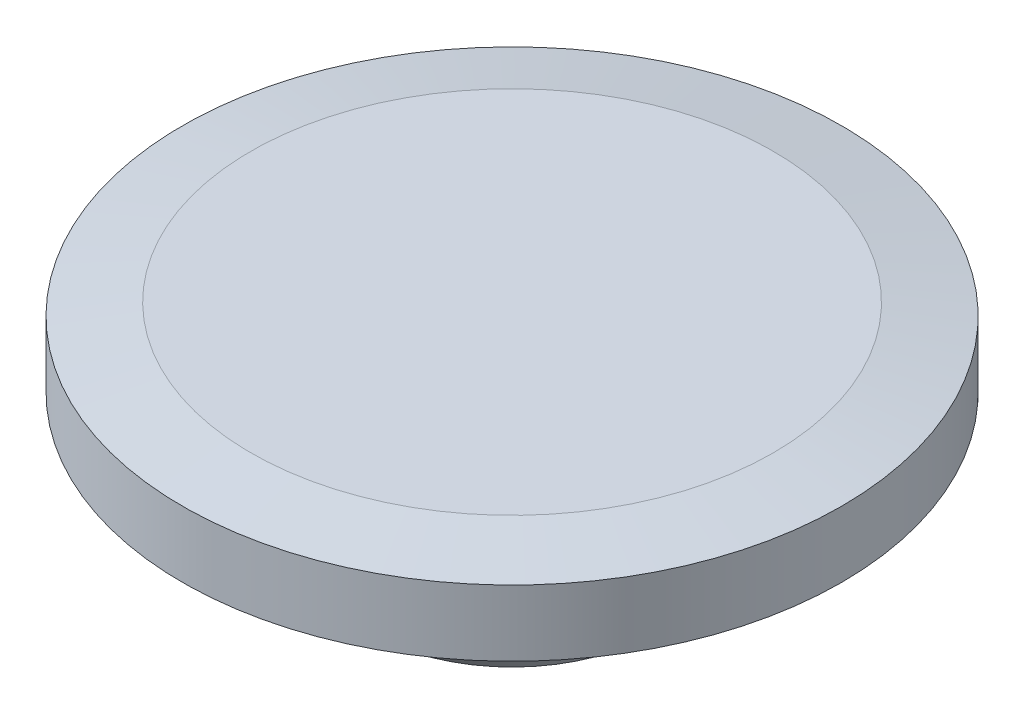
ISO-10303-21;
HEADER;
FILE_DESCRIPTION(('STEP AP214'),'2;1');
FILE_NAME('part.step','',(''),(''),'','','');
FILE_SCHEMA(('AUTOMOTIVE_DESIGN { 1 0 10303 214 1 1 1 1 }'));
ENDSEC;
DATA;
#1=APPLICATION_CONTEXT('core data for automotive mechanical design processes');
#2=APPLICATION_PROTOCOL_DEFINITION('international standard','automotive_design',2000,#1);
#3=PRODUCT_CONTEXT('',#1,'mechanical');
#4=PRODUCT('Part','Part','',(#3));
#5=PRODUCT_RELATED_PRODUCT_CATEGORY('part','',(#4));
#6=PRODUCT_DEFINITION_FORMATION('','',#4);
#7=PRODUCT_DEFINITION_CONTEXT('part definition',#1,'design');
#8=PRODUCT_DEFINITION('design','',#6,#7);
#9=PRODUCT_DEFINITION_SHAPE('','',#8);
#10=(LENGTH_UNIT() NAMED_UNIT(*) SI_UNIT(.MILLI.,.METRE.));
#11=(NAMED_UNIT(*) PLANE_ANGLE_UNIT() SI_UNIT($,.RADIAN.));
#12=(NAMED_UNIT(*) SI_UNIT($,.STERADIAN.) SOLID_ANGLE_UNIT());
#13=UNCERTAINTY_MEASURE_WITH_UNIT(LENGTH_MEASURE(1.E-05),#10,'distance_accuracy_value','');
#14=(GEOMETRIC_REPRESENTATION_CONTEXT(3) GLOBAL_UNCERTAINTY_ASSIGNED_CONTEXT((#13)) GLOBAL_UNIT_ASSIGNED_CONTEXT((#10,
#11,#12)) REPRESENTATION_CONTEXT('',''));
#15=CARTESIAN_POINT('',(0.,0.,0.));
#16=DIRECTION('',(0.,0.,1.));
#17=DIRECTION('',(1.,0.,0.));
#18=AXIS2_PLACEMENT_3D('',#15,#16,#17);
#19=CARTESIAN_POINT('',(0.,-1.6,0.));
#20=DIRECTION('',(0.,-1.,0.));
#21=DIRECTION('',(1.,0.,0.));
#22=AXIS2_PLACEMENT_3D('',#19,#20,#21);
#23=CYLINDRICAL_SURFACE('',#22,3.);
#24=CARTESIAN_POINT('',(0.,3.4,0.));
#25=DIRECTION('',(0.,-1.,0.));
#26=DIRECTION('',(1.,0.,0.));
#27=AXIS2_PLACEMENT_3D('',#24,#25,#26);
#28=CIRCLE('',#27,3.);
#29=CARTESIAN_POINT('',(-2.36167313572391,3.4,-1.85));
#30=VERTEX_POINT('',#29);
#31=CARTESIAN_POINT('',(-2.36167313572391,3.4,1.85));
#32=VERTEX_POINT('',#31);
#33=EDGE_CURVE('E250',#30,#32,#28,.T.);
#34=ORIENTED_EDGE('',*,*,#33,.T.);
#35=DIRECTION('',(0.,-1.,0.));
#36=VECTOR('',#35,1.);
#37=CARTESIAN_POINT('',(-2.36167313572391,-1.6,1.85));
#38=LINE('',#37,#36);
#39=CARTESIAN_POINT('',(-2.36167313572391,-1.6,1.85));
#40=VERTEX_POINT('',#39);
#41=EDGE_CURVE('E246',#32,#40,#38,.T.);
#42=ORIENTED_EDGE('',*,*,#41,.T.);
#43=CARTESIAN_POINT('',(0.,-1.6,0.));
#44=DIRECTION('',(0.,-1.,0.));
#45=DIRECTION('',(1.,0.,0.));
#46=AXIS2_PLACEMENT_3D('',#43,#44,#45);
#47=CIRCLE('',#46,3.);
#48=CARTESIAN_POINT('',(-2.36167313572391,-1.6,-1.85));
#49=VERTEX_POINT('',#48);
#50=EDGE_CURVE('E278',#49,#40,#47,.T.);
#51=ORIENTED_EDGE('',*,*,#50,.F.);
#52=DIRECTION('',(0.,-1.,0.));
#53=VECTOR('',#52,1.);
#54=CARTESIAN_POINT('',(-2.36167313572391,-1.6,-1.85));
#55=LINE('',#54,#53);
#56=EDGE_CURVE('E236',#30,#49,#55,.T.);
#57=ORIENTED_EDGE('',*,*,#56,.F.);
#58=EDGE_LOOP('',(#34,#42,#51,#57));
#59=FACE_BOUND('',#58,.T.);
#60=ADVANCED_FACE('F51',(#59),#23,.T.);
#61=CARTESIAN_POINT('',(0.,-1.6,0.));
#62=DIRECTION('',(0.,1.,0.));
#63=DIRECTION('',(-1.,0.,0.));
#64=AXIS2_PLACEMENT_3D('',#61,#62,#63);
#65=PLANE('',#64);
#66=ORIENTED_EDGE('',*,*,#50,.T.);
#67=DIRECTION('',(1.,0.,0.));
#68=VECTOR('',#67,1.);
#69=CARTESIAN_POINT('',(0.,-1.6,1.85));
#70=LINE('',#69,#68);
#71=CARTESIAN_POINT('',(-0.35,-1.6,1.85));
#72=VERTEX_POINT('',#71);
#73=EDGE_CURVE('E242',#40,#72,#70,.T.);
#74=ORIENTED_EDGE('',*,*,#73,.T.);
#75=DIRECTION('',(0.707106781186548,0.,-0.707106781186547));
#76=VECTOR('',#75,1.);
#77=CARTESIAN_POINT('',(0.75,-1.6,0.75));
#78=LINE('',#77,#76);
#79=CARTESIAN_POINT('',(0.4,-1.6,1.1));
#80=VERTEX_POINT('',#79);
#81=EDGE_CURVE('E298',#72,#80,#78,.T.);
#82=ORIENTED_EDGE('',*,*,#81,.T.);
#83=DIRECTION('',(0.,0.,-1.));
#84=VECTOR('',#83,1.);
#85=CARTESIAN_POINT('',(0.4,-1.6,0.));
#86=LINE('',#85,#84);
#87=CARTESIAN_POINT('',(0.4,-1.6,-1.1));
#88=VERTEX_POINT('',#87);
#89=EDGE_CURVE('E290',#80,#88,#86,.T.);
#90=ORIENTED_EDGE('',*,*,#89,.T.);
#91=DIRECTION('',(0.707106781186547,0.,0.707106781186548));
#92=VECTOR('',#91,1.);
#93=CARTESIAN_POINT('',(0.75,-1.6,-0.75));
#94=LINE('',#93,#92);
#95=CARTESIAN_POINT('',(-0.35,-1.6,-1.85));
#96=VERTEX_POINT('',#95);
#97=EDGE_CURVE('E294',#96,#88,#94,.T.);
#98=ORIENTED_EDGE('',*,*,#97,.F.);
#99=DIRECTION('',(1.,0.,0.));
#100=VECTOR('',#99,1.);
#101=CARTESIAN_POINT('',(0.,-1.6,-1.85));
#102=LINE('',#101,#100);
#103=EDGE_CURVE('E233',#49,#96,#102,.T.);
#104=ORIENTED_EDGE('',*,*,#103,.F.);
#105=EDGE_LOOP('',(#66,#74,#82,#90,#98,#104));
#106=FACE_BOUND('',#105,.T.);
#107=ADVANCED_FACE('F378',(#106),#65,.F.);
#108=CARTESIAN_POINT('',(0.,5.5,0.));
#109=DIRECTION('',(0.,-1.,0.));
#110=DIRECTION('',(1.,0.,0.));
#111=AXIS2_PLACEMENT_3D('',#108,#109,#110);
#112=PLANE('',#111);
#113=CARTESIAN_POINT('',(0.,5.5,0.));
#114=DIRECTION('',(0.,-1.,0.));
#115=DIRECTION('',(1.,0.,0.));
#116=AXIS2_PLACEMENT_3D('',#113,#114,#115);
#117=CIRCLE('',#116,15.0607689879512);
#118=CARTESIAN_POINT('',(15.0607689879512,5.5,0.));
#119=VERTEX_POINT('',#118);
#120=EDGE_CURVE('E274',#119,#119,#117,.T.);
#121=ORIENTED_EDGE('',*,*,#120,.F.);
#122=EDGE_LOOP('',(#121));
#123=FACE_BOUND('',#122,.T.);
#124=ADVANCED_FACE('F374',(#123),#112,.F.);
#125=CARTESIAN_POINT('',(0.,4.80540728933231,0.));
#126=DIRECTION('',(0.,-1.,0.));
#127=DIRECTION('',(1.,0.,0.));
#128=AXIS2_PLACEMENT_3D('',#125,#126,#127);
#129=CONICAL_SURFACE('',#128,19.,1.39626340159547);
#130=ORIENTED_EDGE('',*,*,#120,.T.);
#131=EDGE_LOOP('',(#130));
#132=FACE_BOUND('',#131,.T.);
#133=CARTESIAN_POINT('',(0.,4.80540728933231,0.));
#134=DIRECTION('',(0.,-1.,0.));
#135=DIRECTION('',(1.,0.,0.));
#136=AXIS2_PLACEMENT_3D('',#133,#134,#135);
#137=CIRCLE('',#136,19.);
#138=CARTESIAN_POINT('',(19.,4.80540728933231,0.));
#139=VERTEX_POINT('',#138);
#140=EDGE_CURVE('E270',#139,#139,#137,.T.);
#141=ORIENTED_EDGE('',*,*,#140,.F.);
#142=EDGE_LOOP('',(#141));
#143=FACE_BOUND('',#142,.T.);
#144=ADVANCED_FACE('F370',(#132,#143),#129,.T.);
#145=CARTESIAN_POINT('',(0.,-1.6,0.));
#146=DIRECTION('',(0.,-1.,0.));
#147=DIRECTION('',(1.,0.,0.));
#148=AXIS2_PLACEMENT_3D('',#145,#146,#147);
#149=CYLINDRICAL_SURFACE('',#148,19.);
#150=CARTESIAN_POINT('',(0.,0.999999999999999,0.));
#151=DIRECTION('',(0.,-1.,0.));
#152=DIRECTION('',(1.,0.,0.));
#153=AXIS2_PLACEMENT_3D('',#150,#151,#152);
#154=CIRCLE('',#153,19.);
#155=CARTESIAN_POINT('',(19.,0.999999999999999,0.));
#156=VERTEX_POINT('',#155);
#157=EDGE_CURVE('E286',#156,#156,#154,.F.);
#158=ORIENTED_EDGE('',*,*,#157,.T.);
#159=EDGE_LOOP('',(#158));
#160=FACE_BOUND('',#159,.T.);
#161=ORIENTED_EDGE('',*,*,#140,.T.);
#162=EDGE_LOOP('',(#161));
#163=FACE_BOUND('',#162,.T.);
#164=ADVANCED_FACE('F366',(#160,#163),#149,.T.);
#165=CARTESIAN_POINT('',(0.,0.,0.));
#166=DIRECTION('',(0.,-1.,0.));
#167=DIRECTION('',(1.,0.,0.));
#168=AXIS2_PLACEMENT_3D('',#165,#166,#167);
#169=PLANE('',#168);
#170=CARTESIAN_POINT('',(0.,0.,0.));
#171=DIRECTION('',(0.,-1.,0.));
#172=DIRECTION('',(1.,0.,0.));
#173=AXIS2_PLACEMENT_3D('',#170,#171,#172);
#174=CIRCLE('',#173,10.8556535720254);
#175=CARTESIAN_POINT('',(10.8556535720254,0.,0.));
#176=VERTEX_POINT('',#175);
#177=EDGE_CURVE('E282',#176,#176,#174,.T.);
#178=ORIENTED_EDGE('',*,*,#177,.T.);
#179=EDGE_LOOP('',(#178));
#180=FACE_BOUND('',#179,.T.);
#181=CARTESIAN_POINT('',(0.,0.,0.));
#182=DIRECTION('',(0.,-1.,0.));
#183=DIRECTION('',(1.,0.,0.));
#184=AXIS2_PLACEMENT_3D('',#181,#182,#183);
#185=CIRCLE('',#184,10.35);
#186=CARTESIAN_POINT('',(10.35,0.,0.));
#187=VERTEX_POINT('',#186);
#188=EDGE_CURVE('E266',#187,#187,#185,.T.);
#189=ORIENTED_EDGE('',*,*,#188,.F.);
#190=EDGE_LOOP('',(#189));
#191=FACE_BOUND('',#190,.T.);
#192=ADVANCED_FACE('F362',(#180,#191),#169,.T.);
#193=CARTESIAN_POINT('',(0.,-1.6,0.));
#194=DIRECTION('',(0.,-1.,0.));
#195=DIRECTION('',(1.,0.,0.));
#196=AXIS2_PLACEMENT_3D('',#193,#194,#195);
#197=CYLINDRICAL_SURFACE('',#196,10.35);
#198=CARTESIAN_POINT('',(0.,-0.350000000000001,0.));
#199=DIRECTION('',(0.,-1.,0.));
#200=DIRECTION('',(1.,0.,0.));
#201=AXIS2_PLACEMENT_3D('',#198,#199,#200);
#202=CIRCLE('',#201,10.35);
#203=CARTESIAN_POINT('',(10.35,-0.350000000000001,0.));
#204=VERTEX_POINT('',#203);
#205=EDGE_CURVE('E262',#204,#204,#202,.T.);
#206=ORIENTED_EDGE('',*,*,#205,.F.);
#207=EDGE_LOOP('',(#206));
#208=FACE_BOUND('',#207,.T.);
#209=ORIENTED_EDGE('',*,*,#188,.T.);
#210=EDGE_LOOP('',(#209));
#211=FACE_BOUND('',#210,.T.);
#212=ADVANCED_FACE('F358',(#208,#211),#197,.T.);
#213=CARTESIAN_POINT('',(0.,-0.350000000000001,0.));
#214=DIRECTION('',(0.,1.,0.));
#215=DIRECTION('',(-1.,0.,0.));
#216=AXIS2_PLACEMENT_3D('',#213,#214,#215);
#217=PLANE('',#216);
#218=CARTESIAN_POINT('',(0.,-0.350000000000001,0.));
#219=DIRECTION('',(0.,-1.,0.));
#220=DIRECTION('',(1.,0.,0.));
#221=AXIS2_PLACEMENT_3D('',#218,#219,#220);
#222=CIRCLE('',#221,8.6);
#223=CARTESIAN_POINT('',(8.6,-0.350000000000001,0.));
#224=VERTEX_POINT('',#223);
#225=EDGE_CURVE('E258',#224,#224,#222,.T.);
#226=ORIENTED_EDGE('',*,*,#225,.F.);
#227=EDGE_LOOP('',(#226));
#228=FACE_BOUND('',#227,.T.);
#229=ORIENTED_EDGE('',*,*,#205,.T.);
#230=EDGE_LOOP('',(#229));
#231=FACE_BOUND('',#230,.T.);
#232=ADVANCED_FACE('F354',(#228,#231),#217,.F.);
#233=CARTESIAN_POINT('',(0.,-1.6,0.));
#234=DIRECTION('',(0.,-1.,0.));
#235=DIRECTION('',(1.,0.,0.));
#236=AXIS2_PLACEMENT_3D('',#233,#234,#235);
#237=CYLINDRICAL_SURFACE('',#236,8.6);
#238=CARTESIAN_POINT('',(0.,-6.34999999999999,0.));
#239=DIRECTION('',(0.,1.,0.));
#240=DIRECTION('',(-1.,0.,0.));
#241=AXIS2_PLACEMENT_3D('',#238,#239,#240);
#242=CIRCLE('',#241,8.6);
#243=CARTESIAN_POINT('',(-8.6,-6.34999999999999,0.));
#244=VERTEX_POINT('',#243);
#245=EDGE_CURVE('E11',#244,#244,#242,.T.);
#246=ORIENTED_EDGE('',*,*,#245,.T.);
#247=EDGE_LOOP('',(#246));
#248=FACE_BOUND('',#247,.T.);
#249=ORIENTED_EDGE('',*,*,#225,.T.);
#250=EDGE_LOOP('',(#249));
#251=FACE_BOUND('',#250,.T.);
#252=ADVANCED_FACE('F350',(#248,#251),#237,.T.);
#253=CARTESIAN_POINT('',(0.,-6.85,0.));
#254=DIRECTION('',(0.,1.,0.));
#255=DIRECTION('',(-1.,0.,0.));
#256=AXIS2_PLACEMENT_3D('',#253,#254,#255);
#257=PLANE('',#256);
#258=CARTESIAN_POINT('',(0.,-6.85,0.));
#259=DIRECTION('',(0.,1.,0.));
#260=DIRECTION('',(-1.,0.,0.));
#261=AXIS2_PLACEMENT_3D('',#258,#259,#260);
#262=CIRCLE('',#261,8.31132486540519);
#263=CARTESIAN_POINT('',(-8.31132486540519,-6.85,0.));
#264=VERTEX_POINT('',#263);
#265=EDGE_CURVE('E61',#264,#264,#262,.F.);
#266=ORIENTED_EDGE('',*,*,#265,.T.);
#267=EDGE_LOOP('',(#266));
#268=FACE_BOUND('',#267,.T.);
#269=DIRECTION('',(-0.707106781186547,0.,-0.707106781186548));
#270=VECTOR('',#269,1.);
#271=CARTESIAN_POINT('',(-3.85,-6.85,3.85));
#272=LINE('',#271,#270);
#273=CARTESIAN_POINT('',(-6.487707337822,-6.85,1.212292662178));
#274=VERTEX_POINT('',#273);
#275=CARTESIAN_POINT('',(-6.6,-6.85,1.1));
#276=VERTEX_POINT('',#275);
#277=EDGE_CURVE('E149',#274,#276,#272,.T.);
#278=ORIENTED_EDGE('',*,*,#277,.F.);
#279=CARTESIAN_POINT('',(0.,-6.85,0.));
#280=DIRECTION('',(0.,1.,0.));
#281=DIRECTION('',(-1.,0.,0.));
#282=AXIS2_PLACEMENT_3D('',#279,#280,#281);
#283=CIRCLE('',#282,6.6);
#284=CARTESIAN_POINT('',(-6.487707337822,-6.85,-1.21229266217801));
#285=VERTEX_POINT('',#284);
#286=EDGE_CURVE('E76',#274,#285,#283,.T.);
#287=ORIENTED_EDGE('',*,*,#286,.T.);
#288=DIRECTION('',(-0.707106781186547,0.,0.707106781186548));
#289=VECTOR('',#288,1.);
#290=CARTESIAN_POINT('',(-3.85,-6.85,-3.85));
#291=LINE('',#290,#289);
#292=CARTESIAN_POINT('',(-6.6,-6.85,-1.1));
#293=VERTEX_POINT('',#292);
#294=EDGE_CURVE('E173',#285,#293,#291,.T.);
#295=ORIENTED_EDGE('',*,*,#294,.T.);
#296=DIRECTION('',(0.,0.,1.));
#297=VECTOR('',#296,1.);
#298=CARTESIAN_POINT('',(-6.6,-6.85,0.));
#299=LINE('',#298,#297);
#300=EDGE_CURVE('E160',#293,#276,#299,.T.);
#301=ORIENTED_EDGE('',*,*,#300,.T.);
#302=EDGE_LOOP('',(#278,#287,#295,#301));
#303=FACE_BOUND('',#302,.T.);
#304=ADVANCED_FACE('F172',(#268,#303),#257,.F.);
#305=CARTESIAN_POINT('',(0.,-1.6,0.));
#306=DIRECTION('',(0.,-1.,0.));
#307=DIRECTION('',(1.,0.,0.));
#308=AXIS2_PLACEMENT_3D('',#305,#306,#307);
#309=CYLINDRICAL_SURFACE('',#308,5.6);
#310=DIRECTION('',(0.,-1.,0.));
#311=VECTOR('',#310,1.);
#312=CARTESIAN_POINT('',(-5.28559362796649,-1.6,-1.85));
#313=LINE('',#312,#311);
#314=CARTESIAN_POINT('',(-5.28559362796649,-5.85000000000001,-1.85));
#315=VERTEX_POINT('',#314);
#316=CARTESIAN_POINT('',(-5.28559362796649,3.4,-1.85));
#317=VERTEX_POINT('',#316);
#318=EDGE_CURVE('E230',#315,#317,#313,.F.);
#319=ORIENTED_EDGE('',*,*,#318,.F.);
#320=CARTESIAN_POINT('',(0.,-5.85000000000001,0.));
#321=DIRECTION('',(0.,1.,0.));
#322=DIRECTION('',(-1.,0.,0.));
#323=AXIS2_PLACEMENT_3D('',#320,#321,#322);
#324=CIRCLE('',#323,5.6);
#325=CARTESIAN_POINT('',(-5.28559362796649,-5.85000000000001,1.85));
#326=VERTEX_POINT('',#325);
#327=EDGE_CURVE('E302',#315,#326,#324,.F.);
#328=ORIENTED_EDGE('',*,*,#327,.T.);
#329=DIRECTION('',(0.,-1.,0.));
#330=VECTOR('',#329,1.);
#331=CARTESIAN_POINT('',(-5.28559362796649,-1.6,1.85));
#332=LINE('',#331,#330);
#333=CARTESIAN_POINT('',(-5.28559362796649,3.4,1.85));
#334=VERTEX_POINT('',#333);
#335=EDGE_CURVE('E239',#326,#334,#332,.F.);
#336=ORIENTED_EDGE('',*,*,#335,.T.);
#337=CARTESIAN_POINT('',(0.,3.4,0.));
#338=DIRECTION('',(0.,-1.,0.));
#339=DIRECTION('',(1.,0.,0.));
#340=AXIS2_PLACEMENT_3D('',#337,#338,#339);
#341=CIRCLE('',#340,5.6);
#342=EDGE_CURVE('E254',#317,#334,#341,.T.);
#343=ORIENTED_EDGE('',*,*,#342,.F.);
#344=EDGE_LOOP('',(#319,#328,#336,#343));
#345=FACE_BOUND('',#344,.T.);
#346=ADVANCED_FACE('F343',(#345),#309,.F.);
#347=CARTESIAN_POINT('',(0.,3.4,0.));
#348=DIRECTION('',(0.,1.,0.));
#349=DIRECTION('',(-1.,0.,0.));
#350=AXIS2_PLACEMENT_3D('',#347,#348,#349);
#351=PLANE('',#350);
#352=ORIENTED_EDGE('',*,*,#33,.F.);
#353=DIRECTION('',(-1.,0.,0.));
#354=VECTOR('',#353,1.);
#355=CARTESIAN_POINT('',(0.,3.4,-1.85));
#356=LINE('',#355,#354);
#357=CARTESIAN_POINT('',(-0.35,3.4,-1.85));
#358=VERTEX_POINT('',#357);
#359=EDGE_CURVE('E195',#358,#30,#356,.T.);
#360=ORIENTED_EDGE('',*,*,#359,.F.);
#361=DIRECTION('',(-0.707106781186547,0.,-0.707106781186548));
#362=VECTOR('',#361,1.);
#363=CARTESIAN_POINT('',(0.75,3.4,-0.75));
#364=LINE('',#363,#362);
#365=CARTESIAN_POINT('',(0.4,3.4,-1.1));
#366=VERTEX_POINT('',#365);
#367=EDGE_CURVE('E178',#366,#358,#364,.T.);
#368=ORIENTED_EDGE('',*,*,#367,.F.);
#369=DIRECTION('',(0.,0.,1.));
#370=VECTOR('',#369,1.);
#371=CARTESIAN_POINT('',(0.4,3.4,0.));
#372=LINE('',#371,#370);
#373=CARTESIAN_POINT('',(0.4,3.4,1.1));
#374=VERTEX_POINT('',#373);
#375=EDGE_CURVE('E186',#366,#374,#372,.T.);
#376=ORIENTED_EDGE('',*,*,#375,.T.);
#377=DIRECTION('',(-0.707106781186548,0.,0.707106781186547));
#378=VECTOR('',#377,1.);
#379=CARTESIAN_POINT('',(0.75,3.4,0.75));
#380=LINE('',#379,#378);
#381=CARTESIAN_POINT('',(-0.35,3.4,1.85));
#382=VERTEX_POINT('',#381);
#383=EDGE_CURVE('E181',#374,#382,#380,.T.);
#384=ORIENTED_EDGE('',*,*,#383,.T.);
#385=DIRECTION('',(-1.,0.,0.));
#386=VECTOR('',#385,1.);
#387=CARTESIAN_POINT('',(0.,3.4,1.85));
#388=LINE('',#387,#386);
#389=EDGE_CURVE('E206',#382,#32,#388,.T.);
#390=ORIENTED_EDGE('',*,*,#389,.T.);
#391=EDGE_LOOP('',(#352,#360,#368,#376,#384,#390));
#392=FACE_BOUND('',#391,.T.);
#393=ORIENTED_EDGE('',*,*,#342,.T.);
#394=CARTESIAN_POINT('',(-5.85,3.4,1.85));
#395=VERTEX_POINT('',#394);
#396=EDGE_CURVE('E210',#334,#395,#388,.T.);
#397=ORIENTED_EDGE('',*,*,#396,.T.);
#398=DIRECTION('',(-0.707106781186547,0.,-0.707106781186548));
#399=VECTOR('',#398,1.);
#400=CARTESIAN_POINT('',(-3.85,3.4,3.85));
#401=LINE('',#400,#399);
#402=CARTESIAN_POINT('',(-6.6,3.4,1.1));
#403=VERTEX_POINT('',#402);
#404=EDGE_CURVE('E170',#395,#403,#401,.T.);
#405=ORIENTED_EDGE('',*,*,#404,.T.);
#406=DIRECTION('',(0.,0.,1.));
#407=VECTOR('',#406,1.);
#408=CARTESIAN_POINT('',(-6.6,3.4,0.));
#409=LINE('',#408,#407);
#410=CARTESIAN_POINT('',(-6.6,3.4,-1.1));
#411=VERTEX_POINT('',#410);
#412=EDGE_CURVE('E167',#411,#403,#409,.T.);
#413=ORIENTED_EDGE('',*,*,#412,.F.);
#414=DIRECTION('',(-0.707106781186547,0.,0.707106781186548));
#415=VECTOR('',#414,1.);
#416=CARTESIAN_POINT('',(-3.85,3.4,-3.85));
#417=LINE('',#416,#415);
#418=CARTESIAN_POINT('',(-5.85,3.4,-1.85));
#419=VERTEX_POINT('',#418);
#420=EDGE_CURVE('E198',#419,#411,#417,.T.);
#421=ORIENTED_EDGE('',*,*,#420,.F.);
#422=EDGE_CURVE('E194',#317,#419,#356,.T.);
#423=ORIENTED_EDGE('',*,*,#422,.F.);
#424=EDGE_LOOP('',(#393,#397,#405,#413,#421,#423));
#425=FACE_BOUND('',#424,.T.);
#426=ADVANCED_FACE('F339',(#392,#425),#351,.F.);
#427=CARTESIAN_POINT('',(0.,0.,0.));
#428=DIRECTION('',(0.,1.,0.));
#429=DIRECTION('',(-1.,0.,0.));
#430=AXIS2_PLACEMENT_3D('',#427,#428,#429);
#431=CONICAL_SURFACE('',#430,10.8556535720254,1.44862327915529);
#432=ORIENTED_EDGE('',*,*,#157,.F.);
#433=EDGE_LOOP('',(#432));
#434=FACE_BOUND('',#433,.T.);
#435=ORIENTED_EDGE('',*,*,#177,.F.);
#436=EDGE_LOOP('',(#435));
#437=FACE_BOUND('',#436,.T.);
#438=ADVANCED_FACE('F342',(#434,#437),#431,.T.);
#439=CARTESIAN_POINT('',(0.,11.317701686727,-1.85));
#440=DIRECTION('',(0.,0.,1.));
#441=DIRECTION('',(1.,0.,0.));
#442=AXIS2_PLACEMENT_3D('',#439,#440,#441);
#443=PLANE('',#442);
#444=DIRECTION('',(0.,-1.,0.));
#445=VECTOR('',#444,1.);
#446=CARTESIAN_POINT('',(-5.85,11.317701686727,-1.85));
#447=LINE('',#446,#445);
#448=CARTESIAN_POINT('',(-5.85,-6.38555213489381,-1.85));
#449=VERTEX_POINT('',#448);
#450=EDGE_CURVE('E217',#419,#449,#447,.T.);
#451=ORIENTED_EDGE('',*,*,#450,.T.);
#452=CARTESIAN_POINT('',(-5.85,-6.38555213489381,-1.85));
#453=CARTESIAN_POINT('',(-5.75615734146453,-6.2960562630472,-1.85));
#454=CARTESIAN_POINT('',(-5.66220215128081,-6.20667898577835,-1.85));
#455=CARTESIAN_POINT('',(-5.47406669396896,-6.028161607446,-1.85));
#456=CARTESIAN_POINT('',(-5.37988642680818,-5.93902150641691,-1.85));
#457=CARTESIAN_POINT('',(-5.28559362796649,-5.85000000000001,-1.85));
#458=B_SPLINE_CURVE_WITH_KNOTS('',3,(#452,#453,#454,#455,#456,#457),.UNSPECIFIED.,.F.,.F.,(4,2,
4),(0.,0.389028121207264,0.778056298857137),.UNSPECIFIED.);
#459=EDGE_CURVE('E596',#449,#315,#458,.T.);
#460=ORIENTED_EDGE('',*,*,#459,.T.);
#461=ORIENTED_EDGE('',*,*,#318,.T.);
#462=ORIENTED_EDGE('',*,*,#422,.T.);
#463=EDGE_LOOP('',(#451,#460,#461,#462));
#464=FACE_BOUND('',#463,.T.);
#465=ADVANCED_FACE('F389',(#464),#443,.T.);
#466=CARTESIAN_POINT('',(0.,11.317701686727,1.85));
#467=DIRECTION('',(0.,0.,1.));
#468=DIRECTION('',(1.,0.,0.));
#469=AXIS2_PLACEMENT_3D('',#466,#467,#468);
#470=PLANE('',#469);
#471=ORIENTED_EDGE('',*,*,#335,.F.);
#472=CARTESIAN_POINT('',(-5.28559362796649,-5.85000000000001,1.85));
#473=CARTESIAN_POINT('',(-5.37988642680818,-5.93902150641691,1.85));
#474=CARTESIAN_POINT('',(-5.47406669396896,-6.02816160744601,1.85));
#475=CARTESIAN_POINT('',(-5.66220215128081,-6.20667898577836,1.85));
#476=CARTESIAN_POINT('',(-5.75615734146453,-6.2960562630472,1.85));
#477=CARTESIAN_POINT('',(-5.85,-6.38555213489382,1.85));
#478=B_SPLINE_CURVE_WITH_KNOTS('',3,(#472,#473,#474,#475,#476,#477),.UNSPECIFIED.,.F.,.F.,(4,2,
4),(0.,0.389028177649875,0.77805629885714),.UNSPECIFIED.);
#479=CARTESIAN_POINT('',(-5.85,-6.38555213489382,1.85));
#480=VERTEX_POINT('',#479);
#481=EDGE_CURVE('E306',#326,#480,#478,.T.);
#482=ORIENTED_EDGE('',*,*,#481,.T.);
#483=DIRECTION('',(0.,-1.,0.));
#484=VECTOR('',#483,1.);
#485=CARTESIAN_POINT('',(-5.85,11.317701686727,1.85));
#486=LINE('',#485,#484);
#487=EDGE_CURVE('E205',#395,#480,#486,.T.);
#488=ORIENTED_EDGE('',*,*,#487,.F.);
#489=ORIENTED_EDGE('',*,*,#396,.F.);
#490=EDGE_LOOP('',(#471,#482,#488,#489));
#491=FACE_BOUND('',#490,.T.);
#492=ADVANCED_FACE('F331',(#491),#470,.F.);
#493=CARTESIAN_POINT('',(-3.85,11.317701686727,-3.85));
#494=DIRECTION('',(0.707106781186548,0.,0.707106781186547));
#495=DIRECTION('',(0.707106781186547,0.,-0.707106781186548));
#496=AXIS2_PLACEMENT_3D('',#493,#494,#495);
#497=PLANE('',#496);
#498=ORIENTED_EDGE('',*,*,#294,.F.);
#499=CARTESIAN_POINT('',(-6.487707337822,-6.85,-1.21229266217801));
#500=CARTESIAN_POINT('',(-6.43564447854444,-6.80838814289299,-1.26435552145557));
#501=CARTESIAN_POINT('',(-6.38332740237878,-6.76740707500788,-1.31667259762122));
#502=CARTESIAN_POINT('',(-6.27817945933376,-6.6868625166024,-1.42182054066624));
#503=CARTESIAN_POINT('',(-6.22534881934641,-6.64729843329009,-1.47465118065359));
#504=CARTESIAN_POINT('',(-6.11912174260034,-6.56970646572489,-1.58087825739966));
#505=CARTESIAN_POINT('',(-6.06572527812567,-6.531678657167,-1.63427472187434));
#506=CARTESIAN_POINT('',(-5.95832159388683,-6.45730699725866,-1.74167840611318));
#507=CARTESIAN_POINT('',(-5.90431412497091,-6.42096386610801,-1.79568587502909));
#508=CARTESIAN_POINT('',(-5.85,-6.38555213489382,-1.85));
#509=B_SPLINE_CURVE_WITH_KNOTS('',3,(#499,#500,#501,#502,#503,#504,#505,#506,#507,#508),
.UNSPECIFIED.,.F.,.F.,(4,2,2,2,4),(0.,0.253720318501468,0.507333223516403,0.76095860928908,
1.01469143845071),.UNSPECIFIED.);
#510=EDGE_CURVE('E68',#285,#449,#509,.T.);
#511=ORIENTED_EDGE('',*,*,#510,.T.);
#512=ORIENTED_EDGE('',*,*,#450,.F.);
#513=ORIENTED_EDGE('',*,*,#420,.T.);
#514=DIRECTION('',(0.,-1.,0.));
#515=VECTOR('',#514,1.);
#516=CARTESIAN_POINT('',(-6.6,11.317701686727,-1.1));
#517=LINE('',#516,#515);
#518=EDGE_CURVE('E169',#411,#293,#517,.T.);
#519=ORIENTED_EDGE('',*,*,#518,.T.);
#520=EDGE_LOOP('',(#498,#511,#512,#513,#519));
#521=FACE_BOUND('',#520,.T.);
#522=ADVANCED_FACE('F408',(#521),#497,.T.);
#523=CARTESIAN_POINT('',(-6.6,11.317701686727,0.));
#524=DIRECTION('',(1.,0.,0.));
#525=DIRECTION('',(0.,1.,0.));
#526=AXIS2_PLACEMENT_3D('',#523,#524,#525);
#527=PLANE('',#526);
#528=ORIENTED_EDGE('',*,*,#412,.T.);
#529=DIRECTION('',(0.,-1.,0.));
#530=VECTOR('',#529,1.);
#531=CARTESIAN_POINT('',(-6.6,11.317701686727,1.1));
#532=LINE('',#531,#530);
#533=EDGE_CURVE('E154',#403,#276,#532,.T.);
#534=ORIENTED_EDGE('',*,*,#533,.T.);
#535=ORIENTED_EDGE('',*,*,#300,.F.);
#536=ORIENTED_EDGE('',*,*,#518,.F.);
#537=EDGE_LOOP('',(#528,#534,#535,#536));
#538=FACE_BOUND('',#537,.T.);
#539=ADVANCED_FACE('F164',(#538),#527,.T.);
#540=CARTESIAN_POINT('',(-3.85,11.317701686727,3.85));
#541=DIRECTION('',(-0.707106781186548,0.,0.707106781186547));
#542=DIRECTION('',(0.707106781186547,0.,0.707106781186548));
#543=AXIS2_PLACEMENT_3D('',#540,#541,#542);
#544=PLANE('',#543);
#545=ORIENTED_EDGE('',*,*,#487,.T.);
#546=CARTESIAN_POINT('',(-5.85,-6.38555213489382,1.85));
#547=CARTESIAN_POINT('',(-5.90431412497091,-6.42096386610801,1.79568587502909));
#548=CARTESIAN_POINT('',(-5.95832159388683,-6.45730699725866,1.74167840611317));
#549=CARTESIAN_POINT('',(-6.06572527812567,-6.531678657167,1.63427472187433));
#550=CARTESIAN_POINT('',(-6.11912174260035,-6.56970646572489,1.58087825739965));
#551=CARTESIAN_POINT('',(-6.22534881934642,-6.64729843329009,1.47465118065359));
#552=CARTESIAN_POINT('',(-6.27817945933376,-6.6868625166024,1.42182054066624));
#553=CARTESIAN_POINT('',(-6.38332740237878,-6.76740707500788,1.31667259762122));
#554=CARTESIAN_POINT('',(-6.43564447854444,-6.80838814289299,1.26435552145556));
#555=CARTESIAN_POINT('',(-6.487707337822,-6.85,1.212292662178));
#556=B_SPLINE_CURVE_WITH_KNOTS('',3,(#546,#547,#548,#549,#550,#551,#552,#553,#554,#555),
.UNSPECIFIED.,.F.,.F.,(4,2,2,2,4),(0.,0.253732829161632,0.50735821493431,0.760971119949244,
1.01469143845071),.UNSPECIFIED.);
#557=EDGE_CURVE('E157',#480,#274,#556,.T.);
#558=ORIENTED_EDGE('',*,*,#557,.T.);
#559=ORIENTED_EDGE('',*,*,#277,.T.);
#560=ORIENTED_EDGE('',*,*,#533,.F.);
#561=ORIENTED_EDGE('',*,*,#404,.F.);
#562=EDGE_LOOP('',(#545,#558,#559,#560,#561));
#563=FACE_BOUND('',#562,.T.);
#564=ADVANCED_FACE('F152',(#563),#544,.F.);
#565=CARTESIAN_POINT('',(0.75,11.317701686727,0.75));
#566=DIRECTION('',(0.707106781186547,0.,0.707106781186548));
#567=DIRECTION('',(0.707106781186548,0.,-0.707106781186547));
#568=AXIS2_PLACEMENT_3D('',#565,#566,#567);
#569=PLANE('',#568);
#570=DIRECTION('',(0.,-1.,0.));
#571=VECTOR('',#570,1.);
#572=CARTESIAN_POINT('',(-0.35,11.317701686727,1.85));
#573=LINE('',#572,#571);
#574=EDGE_CURVE('E185',#382,#72,#573,.T.);
#575=ORIENTED_EDGE('',*,*,#574,.F.);
#576=ORIENTED_EDGE('',*,*,#383,.F.);
#577=DIRECTION('',(0.,-1.,0.));
#578=VECTOR('',#577,1.);
#579=CARTESIAN_POINT('',(0.4,11.317701686727,1.1));
#580=LINE('',#579,#578);
#581=EDGE_CURVE('E190',#374,#80,#580,.T.);
#582=ORIENTED_EDGE('',*,*,#581,.T.);
#583=ORIENTED_EDGE('',*,*,#81,.F.);
#584=EDGE_LOOP('',(#575,#576,#582,#583));
#585=FACE_BOUND('',#584,.T.);
#586=ADVANCED_FACE('F334',(#585),#569,.F.);
#587=CARTESIAN_POINT('',(0.75,11.317701686727,-0.75));
#588=DIRECTION('',(-0.707106781186548,0.,0.707106781186547));
#589=DIRECTION('',(0.707106781186547,0.,0.707106781186548));
#590=AXIS2_PLACEMENT_3D('',#587,#588,#589);
#591=PLANE('',#590);
#592=ORIENTED_EDGE('',*,*,#97,.T.);
#593=DIRECTION('',(0.,-1.,0.));
#594=VECTOR('',#593,1.);
#595=CARTESIAN_POINT('',(0.4,11.317701686727,-1.1));
#596=LINE('',#595,#594);
#597=EDGE_CURVE('E191',#366,#88,#596,.T.);
#598=ORIENTED_EDGE('',*,*,#597,.F.);
#599=ORIENTED_EDGE('',*,*,#367,.T.);
#600=DIRECTION('',(0.,-1.,0.));
#601=VECTOR('',#600,1.);
#602=CARTESIAN_POINT('',(-0.35,11.317701686727,-1.85));
#603=LINE('',#602,#601);
#604=EDGE_CURVE('E213',#358,#96,#603,.T.);
#605=ORIENTED_EDGE('',*,*,#604,.T.);
#606=EDGE_LOOP('',(#592,#598,#599,#605));
#607=FACE_BOUND('',#606,.T.);
#608=ADVANCED_FACE('F337',(#607),#591,.T.);
#609=CARTESIAN_POINT('',(0.4,11.317701686727,0.));
#610=DIRECTION('',(1.,0.,0.));
#611=DIRECTION('',(0.,1.,0.));
#612=AXIS2_PLACEMENT_3D('',#609,#610,#611);
#613=PLANE('',#612);
#614=ORIENTED_EDGE('',*,*,#581,.F.);
#615=ORIENTED_EDGE('',*,*,#375,.F.);
#616=ORIENTED_EDGE('',*,*,#597,.T.);
#617=ORIENTED_EDGE('',*,*,#89,.F.);
#618=EDGE_LOOP('',(#614,#615,#616,#617));
#619=FACE_BOUND('',#618,.T.);
#620=ADVANCED_FACE('F329',(#619),#613,.F.);
#621=ORIENTED_EDGE('',*,*,#389,.F.);
#622=ORIENTED_EDGE('',*,*,#574,.T.);
#623=ORIENTED_EDGE('',*,*,#73,.F.);
#624=ORIENTED_EDGE('',*,*,#41,.F.);
#625=EDGE_LOOP('',(#621,#622,#623,#624));
#626=FACE_BOUND('',#625,.T.);
#627=ADVANCED_FACE('F324',(#626),#470,.F.);
#628=ORIENTED_EDGE('',*,*,#56,.T.);
#629=ORIENTED_EDGE('',*,*,#103,.T.);
#630=ORIENTED_EDGE('',*,*,#604,.F.);
#631=ORIENTED_EDGE('',*,*,#359,.T.);
#632=EDGE_LOOP('',(#628,#629,#630,#631));
#633=FACE_BOUND('',#632,.T.);
#634=ADVANCED_FACE('F328',(#633),#443,.T.);
#635=CARTESIAN_POINT('',(0.,-5.85000000000001,0.));
#636=DIRECTION('',(0.,-1.,0.));
#637=DIRECTION('',(1.,0.,0.));
#638=AXIS2_PLACEMENT_3D('',#635,#636,#637);
#639=CONICAL_SURFACE('',#638,5.6,0.785398163397452);
#640=ORIENTED_EDGE('',*,*,#510,.F.);
#641=ORIENTED_EDGE('',*,*,#286,.F.);
#642=ORIENTED_EDGE('',*,*,#557,.F.);
#643=ORIENTED_EDGE('',*,*,#481,.F.);
#644=ORIENTED_EDGE('',*,*,#327,.F.);
#645=ORIENTED_EDGE('',*,*,#459,.F.);
#646=EDGE_LOOP('',(#640,#641,#642,#643,#644,#645));
#647=FACE_BOUND('',#646,.T.);
#648=ADVANCED_FACE('F321',(#647),#639,.F.);
#649=CARTESIAN_POINT('',(0.,-6.85,0.));
#650=DIRECTION('',(0.,1.,0.));
#651=DIRECTION('',(-1.,0.,0.));
#652=AXIS2_PLACEMENT_3D('',#649,#650,#651);
#653=CONICAL_SURFACE('',#652,8.31132486540519,0.52359877559829);
#654=ORIENTED_EDGE('',*,*,#245,.F.);
#655=EDGE_LOOP('',(#654));
#656=FACE_BOUND('',#655,.T.);
#657=ORIENTED_EDGE('',*,*,#265,.F.);
#658=EDGE_LOOP('',(#657));
#659=FACE_BOUND('',#658,.T.);
#660=ADVANCED_FACE('F54',(#656,#659),#653,.T.);
#661=CLOSED_SHELL('',(#60,#107,#124,#144,#164,#192,#212,#232,#252,#304,#346,#426,#438,#465,#492,
#522,#539,#564,#586,#608,#620,#627,#634,#648,#660));
#662=MANIFOLD_SOLID_BREP('B2',#661);
#663=ADVANCED_BREP_SHAPE_REPRESENTATION('',(#18,#662),#14);
#664=SHAPE_DEFINITION_REPRESENTATION(#9,#663);
ENDSEC;
END-ISO-10303-21;
